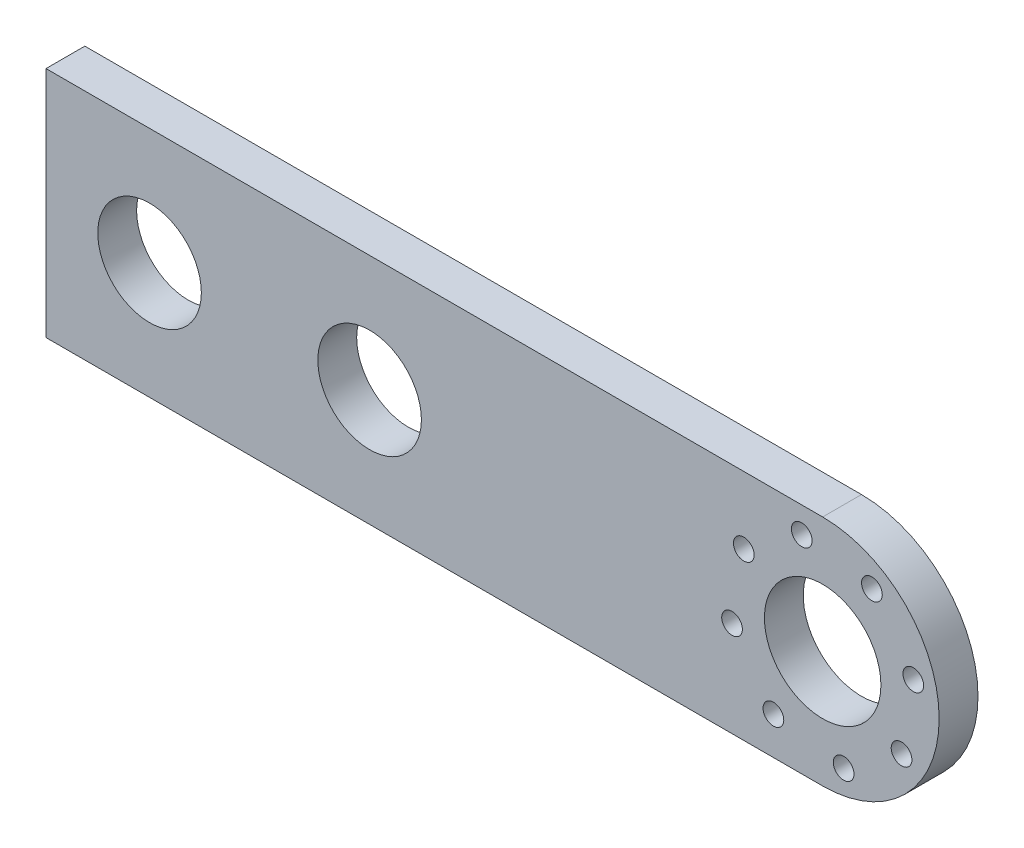
ISO-10303-21;
HEADER;
FILE_DESCRIPTION(('STEP AP214'),'2;1');
FILE_NAME('part.step','',(''),(''),'','','');
FILE_SCHEMA(('AUTOMOTIVE_DESIGN { 1 0 10303 214 1 1 1 1 }'));
ENDSEC;
DATA;
#1=APPLICATION_CONTEXT('core data for automotive mechanical design processes');
#2=APPLICATION_PROTOCOL_DEFINITION('international standard','automotive_design',2000,#1);
#3=PRODUCT_CONTEXT('',#1,'mechanical');
#4=PRODUCT('Part','Part','',(#3));
#5=PRODUCT_RELATED_PRODUCT_CATEGORY('part','',(#4));
#6=PRODUCT_DEFINITION_FORMATION('','',#4);
#7=PRODUCT_DEFINITION_CONTEXT('part definition',#1,'design');
#8=PRODUCT_DEFINITION('design','',#6,#7);
#9=PRODUCT_DEFINITION_SHAPE('','',#8);
#10=(LENGTH_UNIT() NAMED_UNIT(*) SI_UNIT(.MILLI.,.METRE.));
#11=(NAMED_UNIT(*) PLANE_ANGLE_UNIT() SI_UNIT($,.RADIAN.));
#12=(NAMED_UNIT(*) SI_UNIT($,.STERADIAN.) SOLID_ANGLE_UNIT());
#13=UNCERTAINTY_MEASURE_WITH_UNIT(LENGTH_MEASURE(1.E-05),#10,'distance_accuracy_value','');
#14=(GEOMETRIC_REPRESENTATION_CONTEXT(3) GLOBAL_UNCERTAINTY_ASSIGNED_CONTEXT((#13)) GLOBAL_UNIT_ASSIGNED_CONTEXT((#10,
#11,#12)) REPRESENTATION_CONTEXT('',''));
#15=CARTESIAN_POINT('',(0.,0.,0.));
#16=DIRECTION('',(0.,0.,1.));
#17=DIRECTION('',(1.,0.,0.));
#18=AXIS2_PLACEMENT_3D('',#15,#16,#17);
#19=CARTESIAN_POINT('',(24.5978346667474,0.,3.));
#20=DIRECTION('',(0.,0.,-1.));
#21=DIRECTION('',(-1.,0.,0.));
#22=AXIS2_PLACEMENT_3D('',#19,#20,#21);
#23=PLANE('',#22);
#24=CARTESIAN_POINT('',(-27.4021653332526,0.,3.));
#25=DIRECTION('',(0.,0.,1.));
#26=DIRECTION('',(1.,0.,0.));
#27=AXIS2_PLACEMENT_3D('',#24,#25,#26);
#28=CIRCLE('',#27,4.);
#29=CARTESIAN_POINT('',(-23.4021653332526,0.,3.));
#30=VERTEX_POINT('',#29);
#31=EDGE_CURVE('E110',#30,#30,#28,.T.);
#32=ORIENTED_EDGE('',*,*,#31,.F.);
#33=EDGE_LOOP('',(#32));
#34=FACE_BOUND('',#33,.T.);
#35=CARTESIAN_POINT('',(-10.4021653332526,0.,3.));
#36=DIRECTION('',(0.,0.,1.));
#37=DIRECTION('',(1.,0.,0.));
#38=AXIS2_PLACEMENT_3D('',#35,#36,#37);
#39=CIRCLE('',#38,4.);
#40=CARTESIAN_POINT('',(-6.40216533325261,0.,3.));
#41=VERTEX_POINT('',#40);
#42=EDGE_CURVE('E116',#41,#41,#39,.T.);
#43=ORIENTED_EDGE('',*,*,#42,.F.);
#44=EDGE_LOOP('',(#43));
#45=FACE_BOUND('',#44,.T.);
#46=DIRECTION('',(-1.,0.,0.));
#47=VECTOR('',#46,1.);
#48=CARTESIAN_POINT('',(-35.4021653332526,9.,3.));
#49=LINE('',#48,#47);
#50=CARTESIAN_POINT('',(24.5978346667474,9.,3.));
#51=VERTEX_POINT('',#50);
#52=CARTESIAN_POINT('',(-35.4021653332526,9.,3.));
#53=VERTEX_POINT('',#52);
#54=EDGE_CURVE('E52',#51,#53,#49,.T.);
#55=ORIENTED_EDGE('',*,*,#54,.T.);
#56=DIRECTION('',(0.,-1.,0.));
#57=VECTOR('',#56,1.);
#58=CARTESIAN_POINT('',(-35.4021653332526,-9.,3.));
#59=LINE('',#58,#57);
#60=CARTESIAN_POINT('',(-35.4021653332526,-9.,3.));
#61=VERTEX_POINT('',#60);
#62=EDGE_CURVE('E84',#53,#61,#59,.T.);
#63=ORIENTED_EDGE('',*,*,#62,.T.);
#64=DIRECTION('',(1.,0.,0.));
#65=VECTOR('',#64,1.);
#66=CARTESIAN_POINT('',(-35.4021653332526,-9.,3.));
#67=LINE('',#66,#65);
#68=CARTESIAN_POINT('',(24.5978346667474,-9.,3.));
#69=VERTEX_POINT('',#68);
#70=EDGE_CURVE('E88',#61,#69,#67,.T.);
#71=ORIENTED_EDGE('',*,*,#70,.T.);
#72=CARTESIAN_POINT('',(24.5978346667474,0.,3.));
#73=DIRECTION('',(0.,0.,1.));
#74=DIRECTION('',(-1.,0.,0.));
#75=AXIS2_PLACEMENT_3D('',#72,#73,#74);
#76=CIRCLE('',#75,9.);
#77=EDGE_CURVE('E95',#69,#51,#76,.T.);
#78=ORIENTED_EDGE('',*,*,#77,.T.);
#79=EDGE_LOOP('',(#55,#63,#71,#78));
#80=FACE_BOUND('',#79,.T.);
#81=CARTESIAN_POINT('',(24.5978346667474,0.,3.));
#82=DIRECTION('',(0.,0.,1.));
#83=DIRECTION('',(1.,0.,0.));
#84=AXIS2_PLACEMENT_3D('',#81,#82,#83);
#85=CIRCLE('',#84,4.5);
#86=CARTESIAN_POINT('',(29.0978346667474,0.,3.));
#87=VERTEX_POINT('',#86);
#88=EDGE_CURVE('E102',#87,#87,#85,.T.);
#89=ORIENTED_EDGE('',*,*,#88,.F.);
#90=EDGE_LOOP('',(#89));
#91=FACE_BOUND('',#90,.T.);
#92=CARTESIAN_POINT('',(22.9790707898904,7.,3.));
#93=DIRECTION('',(0.,0.,1.));
#94=DIRECTION('',(1.,0.,0.));
#95=AXIS2_PLACEMENT_3D('',#92,#93,#94);
#96=CIRCLE('',#95,0.799999999999999);
#97=CARTESIAN_POINT('',(23.7790707898904,7.,3.));
#98=VERTEX_POINT('',#97);
#99=EDGE_CURVE('E165',#98,#98,#96,.T.);
#100=ORIENTED_EDGE('',*,*,#99,.F.);
#101=EDGE_LOOP('',(#100));
#102=FACE_BOUND('',#101,.T.);
#103=CARTESIAN_POINT('',(28.4029432205878,6.09438638277143,3.));
#104=DIRECTION('',(0.,0.,1.));
#105=DIRECTION('',(1.,0.,0.));
#106=AXIS2_PLACEMENT_3D('',#103,#104,#105);
#107=CIRCLE('',#106,0.799999999999999);
#108=CARTESIAN_POINT('',(29.2029432205878,6.09438638277143,3.));
#109=VERTEX_POINT('',#108);
#110=EDGE_CURVE('E159',#109,#109,#107,.T.);
#111=ORIENTED_EDGE('',*,*,#110,.F.);
#112=EDGE_LOOP('',(#111));
#113=FACE_BOUND('',#112,.T.);
#114=CARTESIAN_POINT('',(31.5978346667476,1.61876387685727,3.));
#115=DIRECTION('',(0.,0.,1.));
#116=DIRECTION('',(1.,0.,0.));
#117=AXIS2_PLACEMENT_3D('',#114,#115,#116);
#118=CIRCLE('',#117,0.799999999999998);
#119=CARTESIAN_POINT('',(32.3978346667475,1.61876387685727,3.));
#120=VERTEX_POINT('',#119);
#121=EDGE_CURVE('E153',#120,#120,#118,.T.);
#122=ORIENTED_EDGE('',*,*,#121,.F.);
#123=EDGE_LOOP('',(#122));
#124=FACE_BOUND('',#123,.T.);
#125=CARTESIAN_POINT('',(30.6922210495189,-3.8051085538402,3.));
#126=DIRECTION('',(0.,0.,1.));
#127=DIRECTION('',(1.,0.,0.));
#128=AXIS2_PLACEMENT_3D('',#125,#126,#127);
#129=CIRCLE('',#128,0.799999999999999);
#130=CARTESIAN_POINT('',(31.492221049519,-3.8051085538402,3.));
#131=VERTEX_POINT('',#130);
#132=EDGE_CURVE('E147',#131,#131,#129,.T.);
#133=ORIENTED_EDGE('',*,*,#132,.F.);
#134=EDGE_LOOP('',(#133));
#135=FACE_BOUND('',#134,.T.);
#136=CARTESIAN_POINT('',(26.2165985436048,-6.99999999999992,3.));
#137=DIRECTION('',(0.,0.,1.));
#138=DIRECTION('',(1.,0.,0.));
#139=AXIS2_PLACEMENT_3D('',#136,#137,#138);
#140=CIRCLE('',#139,0.800000000000001);
#141=CARTESIAN_POINT('',(27.0165985436048,-6.99999999999992,3.));
#142=VERTEX_POINT('',#141);
#143=EDGE_CURVE('E141',#142,#142,#140,.T.);
#144=ORIENTED_EDGE('',*,*,#143,.F.);
#145=EDGE_LOOP('',(#144));
#146=FACE_BOUND('',#145,.T.);
#147=CARTESIAN_POINT('',(20.7927261129073,-6.09438638277132,3.));
#148=DIRECTION('',(0.,0.,1.));
#149=DIRECTION('',(1.,0.,0.));
#150=AXIS2_PLACEMENT_3D('',#147,#148,#149);
#151=CIRCLE('',#150,0.799999999999999);
#152=CARTESIAN_POINT('',(21.5927261129073,-6.09438638277132,3.));
#153=VERTEX_POINT('',#152);
#154=EDGE_CURVE('E135',#153,#153,#151,.T.);
#155=ORIENTED_EDGE('',*,*,#154,.F.);
#156=EDGE_LOOP('',(#155));
#157=FACE_BOUND('',#156,.T.);
#158=CARTESIAN_POINT('',(17.5978346667476,-1.61876387685712,3.));
#159=DIRECTION('',(0.,0.,1.));
#160=DIRECTION('',(1.,0.,0.));
#161=AXIS2_PLACEMENT_3D('',#158,#159,#160);
#162=CIRCLE('',#161,0.8);
#163=CARTESIAN_POINT('',(18.3978346667476,-1.61876387685712,3.));
#164=VERTEX_POINT('',#163);
#165=EDGE_CURVE('E129',#164,#164,#162,.T.);
#166=ORIENTED_EDGE('',*,*,#165,.F.);
#167=EDGE_LOOP('',(#166));
#168=FACE_BOUND('',#167,.T.);
#169=CARTESIAN_POINT('',(18.5034482839763,3.80510855384034,3.));
#170=DIRECTION('',(0.,0.,1.));
#171=DIRECTION('',(1.,0.,0.));
#172=AXIS2_PLACEMENT_3D('',#169,#170,#171);
#173=CIRCLE('',#172,0.799999999999999);
#174=CARTESIAN_POINT('',(19.3034482839763,3.80510855384034,3.));
#175=VERTEX_POINT('',#174);
#176=EDGE_CURVE('E123',#175,#175,#173,.T.);
#177=ORIENTED_EDGE('',*,*,#176,.F.);
#178=EDGE_LOOP('',(#177));
#179=FACE_BOUND('',#178,.T.);
#180=ADVANCED_FACE('F33',(#34,#45,#80,#91,#102,#113,#124,#135,#146,#157,#168,#179),#23,.F.);
#181=CARTESIAN_POINT('',(24.5978346667474,0.,0.));
#182=DIRECTION('',(0.,0.,-1.));
#183=DIRECTION('',(-1.,0.,0.));
#184=AXIS2_PLACEMENT_3D('',#181,#182,#183);
#185=PLANE('',#184);
#186=CARTESIAN_POINT('',(-27.4021653332526,0.,0.));
#187=DIRECTION('',(0.,0.,-1.));
#188=DIRECTION('',(-1.,0.,0.));
#189=AXIS2_PLACEMENT_3D('',#186,#187,#188);
#190=CIRCLE('',#189,4.);
#191=CARTESIAN_POINT('',(-31.4021653332526,0.,0.));
#192=VERTEX_POINT('',#191);
#193=EDGE_CURVE('E37',#192,#192,#190,.T.);
#194=ORIENTED_EDGE('',*,*,#193,.F.);
#195=EDGE_LOOP('',(#194));
#196=FACE_BOUND('',#195,.T.);
#197=CARTESIAN_POINT('',(-10.4021653332526,0.,0.));
#198=DIRECTION('',(0.,0.,-1.));
#199=DIRECTION('',(-1.,0.,0.));
#200=AXIS2_PLACEMENT_3D('',#197,#198,#199);
#201=CIRCLE('',#200,4.);
#202=CARTESIAN_POINT('',(-14.4021653332526,0.,0.));
#203=VERTEX_POINT('',#202);
#204=EDGE_CURVE('E108',#203,#203,#201,.T.);
#205=ORIENTED_EDGE('',*,*,#204,.F.);
#206=EDGE_LOOP('',(#205));
#207=FACE_BOUND('',#206,.T.);
#208=CARTESIAN_POINT('',(17.5978346667476,-1.61876387685712,0.));
#209=DIRECTION('',(0.,0.,1.));
#210=DIRECTION('',(1.,0.,0.));
#211=AXIS2_PLACEMENT_3D('',#208,#209,#210);
#212=CIRCLE('',#211,0.8);
#213=CARTESIAN_POINT('',(18.3978346667476,-1.61876387685712,0.));
#214=VERTEX_POINT('',#213);
#215=EDGE_CURVE('E126',#214,#214,#212,.T.);
#216=ORIENTED_EDGE('',*,*,#215,.T.);
#217=EDGE_LOOP('',(#216));
#218=FACE_BOUND('',#217,.T.);
#219=CARTESIAN_POINT('',(26.2165985436048,-6.99999999999992,0.));
#220=DIRECTION('',(0.,0.,1.));
#221=DIRECTION('',(1.,0.,0.));
#222=AXIS2_PLACEMENT_3D('',#219,#220,#221);
#223=CIRCLE('',#222,0.800000000000001);
#224=CARTESIAN_POINT('',(27.0165985436048,-6.99999999999992,0.));
#225=VERTEX_POINT('',#224);
#226=EDGE_CURVE('E138',#225,#225,#223,.T.);
#227=ORIENTED_EDGE('',*,*,#226,.T.);
#228=EDGE_LOOP('',(#227));
#229=FACE_BOUND('',#228,.T.);
#230=CARTESIAN_POINT('',(31.5978346667476,1.61876387685727,0.));
#231=DIRECTION('',(0.,0.,1.));
#232=DIRECTION('',(1.,0.,0.));
#233=AXIS2_PLACEMENT_3D('',#230,#231,#232);
#234=CIRCLE('',#233,0.799999999999998);
#235=CARTESIAN_POINT('',(32.3978346667475,1.61876387685727,0.));
#236=VERTEX_POINT('',#235);
#237=EDGE_CURVE('E150',#236,#236,#234,.T.);
#238=ORIENTED_EDGE('',*,*,#237,.T.);
#239=EDGE_LOOP('',(#238));
#240=FACE_BOUND('',#239,.T.);
#241=CARTESIAN_POINT('',(22.9790707898904,7.,0.));
#242=DIRECTION('',(0.,0.,1.));
#243=DIRECTION('',(1.,0.,0.));
#244=AXIS2_PLACEMENT_3D('',#241,#242,#243);
#245=CIRCLE('',#244,0.799999999999999);
#246=CARTESIAN_POINT('',(23.7790707898904,7.,0.));
#247=VERTEX_POINT('',#246);
#248=EDGE_CURVE('E162',#247,#247,#245,.T.);
#249=ORIENTED_EDGE('',*,*,#248,.T.);
#250=EDGE_LOOP('',(#249));
#251=FACE_BOUND('',#250,.T.);
#252=DIRECTION('',(0.,-1.,0.));
#253=VECTOR('',#252,1.);
#254=CARTESIAN_POINT('',(-35.4021653332526,-9.,0.));
#255=LINE('',#254,#253);
#256=CARTESIAN_POINT('',(-35.4021653332526,9.,0.));
#257=VERTEX_POINT('',#256);
#258=CARTESIAN_POINT('',(-35.4021653332526,-9.,0.));
#259=VERTEX_POINT('',#258);
#260=EDGE_CURVE('E90',#257,#259,#255,.T.);
#261=ORIENTED_EDGE('',*,*,#260,.F.);
#262=DIRECTION('',(-1.,0.,0.));
#263=VECTOR('',#262,1.);
#264=CARTESIAN_POINT('',(-7.05216533325261,9.,0.));
#265=LINE('',#264,#263);
#266=CARTESIAN_POINT('',(24.5978346667474,9.,0.));
#267=VERTEX_POINT('',#266);
#268=EDGE_CURVE('E77',#267,#257,#265,.T.);
#269=ORIENTED_EDGE('',*,*,#268,.F.);
#270=CARTESIAN_POINT('',(24.5978346667474,0.,0.));
#271=DIRECTION('',(0.,0.,1.));
#272=DIRECTION('',(-1.,0.,0.));
#273=AXIS2_PLACEMENT_3D('',#270,#271,#272);
#274=CIRCLE('',#273,9.);
#275=CARTESIAN_POINT('',(24.5978346667474,-9.,0.));
#276=VERTEX_POINT('',#275);
#277=EDGE_CURVE('E104',#276,#267,#274,.T.);
#278=ORIENTED_EDGE('',*,*,#277,.F.);
#279=DIRECTION('',(1.,0.,0.));
#280=VECTOR('',#279,1.);
#281=CARTESIAN_POINT('',(-35.4021653332526,-9.,0.));
#282=LINE('',#281,#280);
#283=EDGE_CURVE('E70',#259,#276,#282,.T.);
#284=ORIENTED_EDGE('',*,*,#283,.F.);
#285=EDGE_LOOP('',(#261,#269,#278,#284));
#286=FACE_BOUND('',#285,.T.);
#287=CARTESIAN_POINT('',(24.5978346667474,0.,0.));
#288=DIRECTION('',(0.,0.,1.));
#289=DIRECTION('',(1.,0.,0.));
#290=AXIS2_PLACEMENT_3D('',#287,#288,#289);
#291=CIRCLE('',#290,4.5);
#292=CARTESIAN_POINT('',(29.0978346667474,0.,0.));
#293=VERTEX_POINT('',#292);
#294=EDGE_CURVE('E168',#293,#293,#291,.T.);
#295=ORIENTED_EDGE('',*,*,#294,.T.);
#296=EDGE_LOOP('',(#295));
#297=FACE_BOUND('',#296,.T.);
#298=CARTESIAN_POINT('',(28.4029432205878,6.09438638277143,0.));
#299=DIRECTION('',(0.,0.,1.));
#300=DIRECTION('',(1.,0.,0.));
#301=AXIS2_PLACEMENT_3D('',#298,#299,#300);
#302=CIRCLE('',#301,0.799999999999999);
#303=CARTESIAN_POINT('',(29.2029432205878,6.09438638277143,0.));
#304=VERTEX_POINT('',#303);
#305=EDGE_CURVE('E156',#304,#304,#302,.T.);
#306=ORIENTED_EDGE('',*,*,#305,.T.);
#307=EDGE_LOOP('',(#306));
#308=FACE_BOUND('',#307,.T.);
#309=CARTESIAN_POINT('',(30.6922210495189,-3.8051085538402,0.));
#310=DIRECTION('',(0.,0.,1.));
#311=DIRECTION('',(1.,0.,0.));
#312=AXIS2_PLACEMENT_3D('',#309,#310,#311);
#313=CIRCLE('',#312,0.799999999999999);
#314=CARTESIAN_POINT('',(31.492221049519,-3.8051085538402,0.));
#315=VERTEX_POINT('',#314);
#316=EDGE_CURVE('E144',#315,#315,#313,.T.);
#317=ORIENTED_EDGE('',*,*,#316,.T.);
#318=EDGE_LOOP('',(#317));
#319=FACE_BOUND('',#318,.T.);
#320=CARTESIAN_POINT('',(20.7927261129073,-6.09438638277132,0.));
#321=DIRECTION('',(0.,0.,1.));
#322=DIRECTION('',(1.,0.,0.));
#323=AXIS2_PLACEMENT_3D('',#320,#321,#322);
#324=CIRCLE('',#323,0.799999999999999);
#325=CARTESIAN_POINT('',(21.5927261129073,-6.09438638277132,0.));
#326=VERTEX_POINT('',#325);
#327=EDGE_CURVE('E132',#326,#326,#324,.T.);
#328=ORIENTED_EDGE('',*,*,#327,.T.);
#329=EDGE_LOOP('',(#328));
#330=FACE_BOUND('',#329,.T.);
#331=CARTESIAN_POINT('',(18.5034482839763,3.80510855384034,0.));
#332=DIRECTION('',(0.,0.,1.));
#333=DIRECTION('',(1.,0.,0.));
#334=AXIS2_PLACEMENT_3D('',#331,#332,#333);
#335=CIRCLE('',#334,0.799999999999999);
#336=CARTESIAN_POINT('',(19.3034482839763,3.80510855384034,0.));
#337=VERTEX_POINT('',#336);
#338=EDGE_CURVE('E114',#337,#337,#335,.T.);
#339=ORIENTED_EDGE('',*,*,#338,.T.);
#340=EDGE_LOOP('',(#339));
#341=FACE_BOUND('',#340,.T.);
#342=ADVANCED_FACE('F176',(#196,#207,#218,#229,#240,#251,#286,#297,#308,#319,#330,#341),#185,.T.);
#343=CARTESIAN_POINT('',(-35.4021653332526,-9.,3.));
#344=DIRECTION('',(1.,0.,0.));
#345=DIRECTION('',(0.,0.,-1.));
#346=AXIS2_PLACEMENT_3D('',#343,#344,#345);
#347=PLANE('',#346);
#348=ORIENTED_EDGE('',*,*,#260,.T.);
#349=DIRECTION('',(0.,0.,-1.));
#350=VECTOR('',#349,1.);
#351=CARTESIAN_POINT('',(-35.4021653332526,-9.,3.));
#352=LINE('',#351,#350);
#353=EDGE_CURVE('E43',#61,#259,#352,.T.);
#354=ORIENTED_EDGE('',*,*,#353,.F.);
#355=ORIENTED_EDGE('',*,*,#62,.F.);
#356=DIRECTION('',(0.,0.,-1.));
#357=VECTOR('',#356,1.);
#358=CARTESIAN_POINT('',(-35.4021653332526,9.,3.));
#359=LINE('',#358,#357);
#360=EDGE_CURVE('E11',#53,#257,#359,.T.);
#361=ORIENTED_EDGE('',*,*,#360,.T.);
#362=EDGE_LOOP('',(#348,#354,#355,#361));
#363=FACE_BOUND('',#362,.T.);
#364=ADVANCED_FACE('F35',(#363),#347,.F.);
#365=CARTESIAN_POINT('',(-35.4021653332526,-9.,3.));
#366=DIRECTION('',(0.,1.,0.));
#367=DIRECTION('',(0.,0.,1.));
#368=AXIS2_PLACEMENT_3D('',#365,#366,#367);
#369=PLANE('',#368);
#370=ORIENTED_EDGE('',*,*,#283,.T.);
#371=DIRECTION('',(0.,0.,-1.));
#372=VECTOR('',#371,1.);
#373=CARTESIAN_POINT('',(24.5978346667474,-9.,3.));
#374=LINE('',#373,#372);
#375=EDGE_CURVE('E91',#69,#276,#374,.T.);
#376=ORIENTED_EDGE('',*,*,#375,.F.);
#377=ORIENTED_EDGE('',*,*,#70,.F.);
#378=ORIENTED_EDGE('',*,*,#353,.T.);
#379=EDGE_LOOP('',(#370,#376,#377,#378));
#380=FACE_BOUND('',#379,.T.);
#381=ADVANCED_FACE('F93',(#380),#369,.F.);
#382=CARTESIAN_POINT('',(24.5978346667474,0.,3.));
#383=DIRECTION('',(0.,0.,-1.));
#384=DIRECTION('',(-1.,0.,0.));
#385=AXIS2_PLACEMENT_3D('',#382,#383,#384);
#386=CYLINDRICAL_SURFACE('',#385,9.);
#387=ORIENTED_EDGE('',*,*,#277,.T.);
#388=DIRECTION('',(0.,0.,-1.));
#389=VECTOR('',#388,1.);
#390=CARTESIAN_POINT('',(24.5978346667474,9.,3.));
#391=LINE('',#390,#389);
#392=EDGE_CURVE('E97',#51,#267,#391,.T.);
#393=ORIENTED_EDGE('',*,*,#392,.F.);
#394=ORIENTED_EDGE('',*,*,#77,.F.);
#395=ORIENTED_EDGE('',*,*,#375,.T.);
#396=EDGE_LOOP('',(#387,#393,#394,#395));
#397=FACE_BOUND('',#396,.T.);
#398=ADVANCED_FACE('F192',(#397),#386,.T.);
#399=CARTESIAN_POINT('',(-7.05216533325261,9.,3.));
#400=DIRECTION('',(0.,-1.,0.));
#401=DIRECTION('',(1.,0.,0.));
#402=AXIS2_PLACEMENT_3D('',#399,#400,#401);
#403=PLANE('',#402);
#404=ORIENTED_EDGE('',*,*,#268,.T.);
#405=ORIENTED_EDGE('',*,*,#360,.F.);
#406=ORIENTED_EDGE('',*,*,#54,.F.);
#407=ORIENTED_EDGE('',*,*,#392,.T.);
#408=EDGE_LOOP('',(#404,#405,#406,#407));
#409=FACE_BOUND('',#408,.T.);
#410=ADVANCED_FACE('F182',(#409),#403,.F.);
#411=CARTESIAN_POINT('',(24.5978346667474,0.,3.));
#412=DIRECTION('',(0.,0.,-1.));
#413=DIRECTION('',(-1.,0.,0.));
#414=AXIS2_PLACEMENT_3D('',#411,#412,#413);
#415=CYLINDRICAL_SURFACE('',#414,4.5);
#416=ORIENTED_EDGE('',*,*,#88,.T.);
#417=EDGE_LOOP('',(#416));
#418=FACE_BOUND('',#417,.T.);
#419=ORIENTED_EDGE('',*,*,#294,.F.);
#420=EDGE_LOOP('',(#419));
#421=FACE_BOUND('',#420,.T.);
#422=ADVANCED_FACE('F179',(#418,#421),#415,.F.);
#423=CARTESIAN_POINT('',(22.9790707898904,7.,3.));
#424=DIRECTION('',(0.,0.,-1.));
#425=DIRECTION('',(-1.,0.,0.));
#426=AXIS2_PLACEMENT_3D('',#423,#424,#425);
#427=CYLINDRICAL_SURFACE('',#426,0.799999999999999);
#428=ORIENTED_EDGE('',*,*,#99,.T.);
#429=EDGE_LOOP('',(#428));
#430=FACE_BOUND('',#429,.T.);
#431=ORIENTED_EDGE('',*,*,#248,.F.);
#432=EDGE_LOOP('',(#431));
#433=FACE_BOUND('',#432,.T.);
#434=ADVANCED_FACE('F181',(#430,#433),#427,.F.);
#435=CARTESIAN_POINT('',(28.4029432205878,6.09438638277143,3.));
#436=DIRECTION('',(0.,0.,-1.));
#437=DIRECTION('',(-1.,0.,0.));
#438=AXIS2_PLACEMENT_3D('',#435,#436,#437);
#439=CYLINDRICAL_SURFACE('',#438,0.799999999999999);
#440=ORIENTED_EDGE('',*,*,#110,.T.);
#441=EDGE_LOOP('',(#440));
#442=FACE_BOUND('',#441,.T.);
#443=ORIENTED_EDGE('',*,*,#305,.F.);
#444=EDGE_LOOP('',(#443));
#445=FACE_BOUND('',#444,.T.);
#446=ADVANCED_FACE('F189',(#442,#445),#439,.F.);
#447=CARTESIAN_POINT('',(31.5978346667476,1.61876387685727,3.));
#448=DIRECTION('',(0.,0.,-1.));
#449=DIRECTION('',(-1.,0.,0.));
#450=AXIS2_PLACEMENT_3D('',#447,#448,#449);
#451=CYLINDRICAL_SURFACE('',#450,0.799999999999998);
#452=ORIENTED_EDGE('',*,*,#121,.T.);
#453=EDGE_LOOP('',(#452));
#454=FACE_BOUND('',#453,.T.);
#455=ORIENTED_EDGE('',*,*,#237,.F.);
#456=EDGE_LOOP('',(#455));
#457=FACE_BOUND('',#456,.T.);
#458=ADVANCED_FACE('F263',(#454,#457),#451,.F.);
#459=CARTESIAN_POINT('',(30.6922210495189,-3.8051085538402,3.));
#460=DIRECTION('',(0.,0.,-1.));
#461=DIRECTION('',(-1.,0.,0.));
#462=AXIS2_PLACEMENT_3D('',#459,#460,#461);
#463=CYLINDRICAL_SURFACE('',#462,0.799999999999999);
#464=ORIENTED_EDGE('',*,*,#132,.T.);
#465=EDGE_LOOP('',(#464));
#466=FACE_BOUND('',#465,.T.);
#467=ORIENTED_EDGE('',*,*,#316,.F.);
#468=EDGE_LOOP('',(#467));
#469=FACE_BOUND('',#468,.T.);
#470=ADVANCED_FACE('F259',(#466,#469),#463,.F.);
#471=CARTESIAN_POINT('',(26.2165985436048,-6.99999999999992,3.));
#472=DIRECTION('',(0.,0.,-1.));
#473=DIRECTION('',(-1.,0.,0.));
#474=AXIS2_PLACEMENT_3D('',#471,#472,#473);
#475=CYLINDRICAL_SURFACE('',#474,0.800000000000001);
#476=ORIENTED_EDGE('',*,*,#143,.T.);
#477=EDGE_LOOP('',(#476));
#478=FACE_BOUND('',#477,.T.);
#479=ORIENTED_EDGE('',*,*,#226,.F.);
#480=EDGE_LOOP('',(#479));
#481=FACE_BOUND('',#480,.T.);
#482=ADVANCED_FACE('F255',(#478,#481),#475,.F.);
#483=CARTESIAN_POINT('',(20.7927261129073,-6.09438638277132,3.));
#484=DIRECTION('',(0.,0.,-1.));
#485=DIRECTION('',(-1.,0.,0.));
#486=AXIS2_PLACEMENT_3D('',#483,#484,#485);
#487=CYLINDRICAL_SURFACE('',#486,0.799999999999999);
#488=ORIENTED_EDGE('',*,*,#154,.T.);
#489=EDGE_LOOP('',(#488));
#490=FACE_BOUND('',#489,.T.);
#491=ORIENTED_EDGE('',*,*,#327,.F.);
#492=EDGE_LOOP('',(#491));
#493=FACE_BOUND('',#492,.T.);
#494=ADVANCED_FACE('F251',(#490,#493),#487,.F.);
#495=CARTESIAN_POINT('',(17.5978346667476,-1.61876387685712,3.));
#496=DIRECTION('',(0.,0.,-1.));
#497=DIRECTION('',(-1.,0.,0.));
#498=AXIS2_PLACEMENT_3D('',#495,#496,#497);
#499=CYLINDRICAL_SURFACE('',#498,0.8);
#500=ORIENTED_EDGE('',*,*,#165,.T.);
#501=EDGE_LOOP('',(#500));
#502=FACE_BOUND('',#501,.T.);
#503=ORIENTED_EDGE('',*,*,#215,.F.);
#504=EDGE_LOOP('',(#503));
#505=FACE_BOUND('',#504,.T.);
#506=ADVANCED_FACE('F247',(#502,#505),#499,.F.);
#507=CARTESIAN_POINT('',(18.5034482839763,3.80510855384034,3.));
#508=DIRECTION('',(0.,0.,-1.));
#509=DIRECTION('',(-1.,0.,0.));
#510=AXIS2_PLACEMENT_3D('',#507,#508,#509);
#511=CYLINDRICAL_SURFACE('',#510,0.799999999999999);
#512=ORIENTED_EDGE('',*,*,#176,.T.);
#513=EDGE_LOOP('',(#512));
#514=FACE_BOUND('',#513,.T.);
#515=ORIENTED_EDGE('',*,*,#338,.F.);
#516=EDGE_LOOP('',(#515));
#517=FACE_BOUND('',#516,.T.);
#518=ADVANCED_FACE('F230',(#514,#517),#511,.F.);
#519=CARTESIAN_POINT('',(-10.4021653332526,0.,-7.));
#520=DIRECTION('',(0.,0.,1.));
#521=DIRECTION('',(1.,0.,0.));
#522=AXIS2_PLACEMENT_3D('',#519,#520,#521);
#523=CYLINDRICAL_SURFACE('',#522,4.);
#524=ORIENTED_EDGE('',*,*,#204,.T.);
#525=EDGE_LOOP('',(#524));
#526=FACE_BOUND('',#525,.T.);
#527=ORIENTED_EDGE('',*,*,#42,.T.);
#528=EDGE_LOOP('',(#527));
#529=FACE_BOUND('',#528,.T.);
#530=ADVANCED_FACE('F224',(#526,#529),#523,.F.);
#531=CARTESIAN_POINT('',(-27.4021653332526,0.,-7.));
#532=DIRECTION('',(0.,0.,1.));
#533=DIRECTION('',(1.,0.,0.));
#534=AXIS2_PLACEMENT_3D('',#531,#532,#533);
#535=CYLINDRICAL_SURFACE('',#534,4.);
#536=ORIENTED_EDGE('',*,*,#193,.T.);
#537=EDGE_LOOP('',(#536));
#538=FACE_BOUND('',#537,.T.);
#539=ORIENTED_EDGE('',*,*,#31,.T.);
#540=EDGE_LOOP('',(#539));
#541=FACE_BOUND('',#540,.T.);
#542=ADVANCED_FACE('F229',(#538,#541),#535,.F.);
#543=CLOSED_SHELL('',(#180,#342,#364,#381,#398,#410,#422,#434,#446,#458,#470,#482,#494,#506,
#518,#530,#542));
#544=MANIFOLD_SOLID_BREP('B2',#543);
#545=ADVANCED_BREP_SHAPE_REPRESENTATION('',(#18,#544),#14);
#546=SHAPE_DEFINITION_REPRESENTATION(#9,#545);
ENDSEC;
END-ISO-10303-21;
